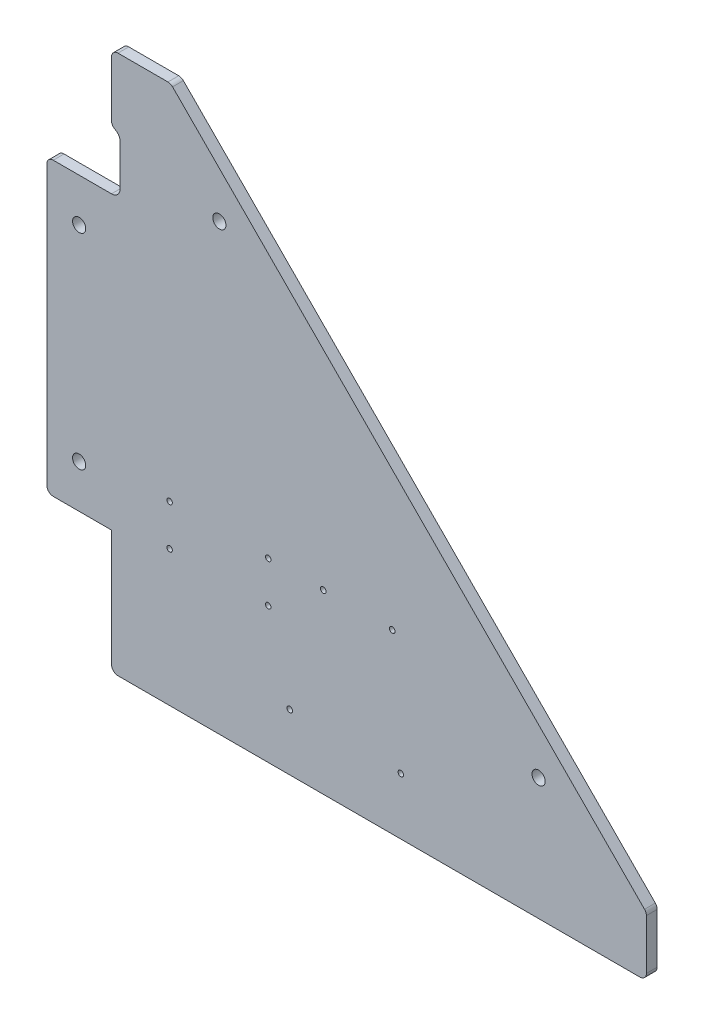
ISO-10303-21;
HEADER;
FILE_DESCRIPTION(('STEP AP214'),'2;1');
FILE_NAME('part.step','',(''),(''),'','','');
FILE_SCHEMA(('AUTOMOTIVE_DESIGN { 1 0 10303 214 1 1 1 1 }'));
ENDSEC;
DATA;
#1=APPLICATION_CONTEXT('core data for automotive mechanical design processes');
#2=APPLICATION_PROTOCOL_DEFINITION('international standard','automotive_design',2000,#1);
#3=PRODUCT_CONTEXT('',#1,'mechanical');
#4=PRODUCT('Part','Part','',(#3));
#5=PRODUCT_RELATED_PRODUCT_CATEGORY('part','',(#4));
#6=PRODUCT_DEFINITION_FORMATION('','',#4);
#7=PRODUCT_DEFINITION_CONTEXT('part definition',#1,'design');
#8=PRODUCT_DEFINITION('design','',#6,#7);
#9=PRODUCT_DEFINITION_SHAPE('','',#8);
#10=(LENGTH_UNIT() NAMED_UNIT(*) SI_UNIT(.MILLI.,.METRE.));
#11=(NAMED_UNIT(*) PLANE_ANGLE_UNIT() SI_UNIT($,.RADIAN.));
#12=(NAMED_UNIT(*) SI_UNIT($,.STERADIAN.) SOLID_ANGLE_UNIT());
#13=UNCERTAINTY_MEASURE_WITH_UNIT(LENGTH_MEASURE(1.E-05),#10,'distance_accuracy_value','');
#14=(GEOMETRIC_REPRESENTATION_CONTEXT(3) GLOBAL_UNCERTAINTY_ASSIGNED_CONTEXT((#13)) GLOBAL_UNIT_ASSIGNED_CONTEXT((#10,
#11,#12)) REPRESENTATION_CONTEXT('',''));
#15=CARTESIAN_POINT('',(0.,0.,0.));
#16=DIRECTION('',(0.,0.,1.));
#17=DIRECTION('',(1.,0.,0.));
#18=AXIS2_PLACEMENT_3D('',#15,#16,#17);
#19=CARTESIAN_POINT('',(30.,139.,5.));
#20=DIRECTION('',(0.,0.,-1.));
#21=DIRECTION('',(-1.,0.,0.));
#22=AXIS2_PLACEMENT_3D('',#19,#20,#21);
#23=CYLINDRICAL_SURFACE('',#22,4.);
#24=CARTESIAN_POINT('',(30.,139.,0.));
#25=DIRECTION('',(0.,0.,1.));
#26=DIRECTION('',(1.,0.,0.));
#27=AXIS2_PLACEMENT_3D('',#24,#25,#26);
#28=CIRCLE('',#27,4.);
#29=CARTESIAN_POINT('',(30.,135.,0.));
#30=VERTEX_POINT('',#29);
#31=CARTESIAN_POINT('',(34.,139.,0.));
#32=VERTEX_POINT('',#31);
#33=EDGE_CURVE('E188',#30,#32,#28,.T.);
#34=ORIENTED_EDGE('',*,*,#33,.F.);
#35=DIRECTION('',(0.,0.,-1.));
#36=VECTOR('',#35,1.);
#37=CARTESIAN_POINT('',(30.,135.,5.));
#38=LINE('',#37,#36);
#39=CARTESIAN_POINT('',(30.,135.,5.));
#40=VERTEX_POINT('',#39);
#41=EDGE_CURVE('E177',#40,#30,#38,.T.);
#42=ORIENTED_EDGE('',*,*,#41,.F.);
#43=CARTESIAN_POINT('',(30.,139.,5.));
#44=DIRECTION('',(0.,0.,1.));
#45=DIRECTION('',(1.,0.,0.));
#46=AXIS2_PLACEMENT_3D('',#43,#44,#45);
#47=CIRCLE('',#46,4.);
#48=CARTESIAN_POINT('',(34.,139.,5.));
#49=VERTEX_POINT('',#48);
#50=EDGE_CURVE('E183',#40,#49,#47,.T.);
#51=ORIENTED_EDGE('',*,*,#50,.T.);
#52=DIRECTION('',(0.,0.,-1.));
#53=VECTOR('',#52,1.);
#54=CARTESIAN_POINT('',(34.,139.,5.));
#55=LINE('',#54,#53);
#56=EDGE_CURVE('E226',#49,#32,#55,.T.);
#57=ORIENTED_EDGE('',*,*,#56,.T.);
#58=EDGE_LOOP('',(#34,#42,#51,#57));
#59=FACE_BOUND('',#58,.T.);
#60=ADVANCED_FACE('F35',(#59),#23,.F.);
#61=CARTESIAN_POINT('',(0.,135.,5.));
#62=DIRECTION('',(0.,1.,0.));
#63=DIRECTION('',(0.,0.,1.));
#64=AXIS2_PLACEMENT_3D('',#61,#62,#63);
#65=PLANE('',#64);
#66=DIRECTION('',(1.,0.,0.));
#67=VECTOR('',#66,1.);
#68=CARTESIAN_POINT('',(0.,135.,0.));
#69=LINE('',#68,#67);
#70=CARTESIAN_POINT('',(3.,135.,0.));
#71=VERTEX_POINT('',#70);
#72=EDGE_CURVE('E253',#71,#30,#69,.T.);
#73=ORIENTED_EDGE('',*,*,#72,.F.);
#74=DIRECTION('',(0.,0.,-1.));
#75=VECTOR('',#74,1.);
#76=CARTESIAN_POINT('',(3.,135.,5.));
#77=LINE('',#76,#75);
#78=CARTESIAN_POINT('',(3.,135.,5.));
#79=VERTEX_POINT('',#78);
#80=EDGE_CURVE('E11',#71,#79,#77,.F.);
#81=ORIENTED_EDGE('',*,*,#80,.T.);
#82=DIRECTION('',(1.,0.,0.));
#83=VECTOR('',#82,1.);
#84=CARTESIAN_POINT('',(0.,135.,5.));
#85=LINE('',#84,#83);
#86=EDGE_CURVE('E173',#79,#40,#85,.T.);
#87=ORIENTED_EDGE('',*,*,#86,.T.);
#88=ORIENTED_EDGE('',*,*,#41,.T.);
#89=EDGE_LOOP('',(#73,#81,#87,#88));
#90=FACE_BOUND('',#89,.T.);
#91=ADVANCED_FACE('F176',(#90),#65,.T.);
#92=CARTESIAN_POINT('',(0.,0.,5.));
#93=DIRECTION('',(-1.,0.,0.));
#94=DIRECTION('',(0.,0.,1.));
#95=AXIS2_PLACEMENT_3D('',#92,#93,#94);
#96=PLANE('',#95);
#97=DIRECTION('',(0.,1.,0.));
#98=VECTOR('',#97,1.);
#99=CARTESIAN_POINT('',(0.,0.,0.));
#100=LINE('',#99,#98);
#101=CARTESIAN_POINT('',(0.,3.,0.));
#102=VERTEX_POINT('',#101);
#103=CARTESIAN_POINT('',(0.,132.,0.));
#104=VERTEX_POINT('',#103);
#105=EDGE_CURVE('E255',#102,#104,#100,.T.);
#106=ORIENTED_EDGE('',*,*,#105,.F.);
#107=DIRECTION('',(0.,0.,-1.));
#108=VECTOR('',#107,1.);
#109=CARTESIAN_POINT('',(0.,3.,5.));
#110=LINE('',#109,#108);
#111=CARTESIAN_POINT('',(0.,3.,5.));
#112=VERTEX_POINT('',#111);
#113=EDGE_CURVE('E43',#102,#112,#110,.F.);
#114=ORIENTED_EDGE('',*,*,#113,.T.);
#115=DIRECTION('',(0.,1.,0.));
#116=VECTOR('',#115,1.);
#117=CARTESIAN_POINT('',(0.,0.,5.));
#118=LINE('',#117,#116);
#119=CARTESIAN_POINT('',(0.,132.,5.));
#120=VERTEX_POINT('',#119);
#121=EDGE_CURVE('E182',#112,#120,#118,.T.);
#122=ORIENTED_EDGE('',*,*,#121,.T.);
#123=DIRECTION('',(0.,0.,-1.));
#124=VECTOR('',#123,1.);
#125=CARTESIAN_POINT('',(0.,132.,5.));
#126=LINE('',#125,#124);
#127=EDGE_CURVE('E351',#120,#104,#126,.T.);
#128=ORIENTED_EDGE('',*,*,#127,.T.);
#129=EDGE_LOOP('',(#106,#114,#122,#128));
#130=FACE_BOUND('',#129,.T.);
#131=ADVANCED_FACE('F357',(#130),#96,.T.);
#132=CARTESIAN_POINT('',(0.,0.,5.));
#133=DIRECTION('',(0.,-1.,0.));
#134=DIRECTION('',(1.,0.,0.));
#135=AXIS2_PLACEMENT_3D('',#132,#133,#134);
#136=PLANE('',#135);
#137=DIRECTION('',(-1.,0.,0.));
#138=VECTOR('',#137,1.);
#139=CARTESIAN_POINT('',(0.,0.,5.));
#140=LINE('',#139,#138);
#141=CARTESIAN_POINT('',(30.,0.,5.));
#142=VERTEX_POINT('',#141);
#143=CARTESIAN_POINT('',(3.,0.,5.));
#144=VERTEX_POINT('',#143);
#145=EDGE_CURVE('E206',#142,#144,#140,.T.);
#146=ORIENTED_EDGE('',*,*,#145,.T.);
#147=DIRECTION('',(0.,0.,-1.));
#148=VECTOR('',#147,1.);
#149=CARTESIAN_POINT('',(3.,0.,5.));
#150=LINE('',#149,#148);
#151=CARTESIAN_POINT('',(3.,0.,0.));
#152=VERTEX_POINT('',#151);
#153=EDGE_CURVE('E348',#144,#152,#150,.T.);
#154=ORIENTED_EDGE('',*,*,#153,.T.);
#155=DIRECTION('',(-1.,0.,0.));
#156=VECTOR('',#155,1.);
#157=CARTESIAN_POINT('',(0.,0.,0.));
#158=LINE('',#157,#156);
#159=CARTESIAN_POINT('',(30.,0.,0.));
#160=VERTEX_POINT('',#159);
#161=EDGE_CURVE('E258',#160,#152,#158,.T.);
#162=ORIENTED_EDGE('',*,*,#161,.F.);
#163=DIRECTION('',(0.,0.,-1.));
#164=VECTOR('',#163,1.);
#165=CARTESIAN_POINT('',(30.,0.,5.));
#166=LINE('',#165,#164);
#167=EDGE_CURVE('E190',#142,#160,#166,.T.);
#168=ORIENTED_EDGE('',*,*,#167,.F.);
#169=EDGE_LOOP('',(#146,#154,#162,#168));
#170=FACE_BOUND('',#169,.T.);
#171=ADVANCED_FACE('F366',(#170),#136,.T.);
#172=CARTESIAN_POINT('',(30.,0.,5.));
#173=DIRECTION('',(-1.,0.,0.));
#174=DIRECTION('',(0.,-1.,0.));
#175=AXIS2_PLACEMENT_3D('',#172,#173,#174);
#176=PLANE('',#175);
#177=DIRECTION('',(0.,1.,0.));
#178=VECTOR('',#177,1.);
#179=CARTESIAN_POINT('',(30.,0.,0.));
#180=LINE('',#179,#178);
#181=CARTESIAN_POINT('',(30.,-54.,0.));
#182=VERTEX_POINT('',#181);
#183=EDGE_CURVE('E261',#182,#160,#180,.T.);
#184=ORIENTED_EDGE('',*,*,#183,.F.);
#185=DIRECTION('',(0.,0.,-1.));
#186=VECTOR('',#185,1.);
#187=CARTESIAN_POINT('',(30.,-54.,5.));
#188=LINE('',#187,#186);
#189=CARTESIAN_POINT('',(30.,-54.,5.));
#190=VERTEX_POINT('',#189);
#191=EDGE_CURVE('E346',#182,#190,#188,.F.);
#192=ORIENTED_EDGE('',*,*,#191,.T.);
#193=DIRECTION('',(0.,1.,0.));
#194=VECTOR('',#193,1.);
#195=CARTESIAN_POINT('',(30.,0.,5.));
#196=LINE('',#195,#194);
#197=EDGE_CURVE('E209',#190,#142,#196,.T.);
#198=ORIENTED_EDGE('',*,*,#197,.T.);
#199=ORIENTED_EDGE('',*,*,#167,.T.);
#200=EDGE_LOOP('',(#184,#192,#198,#199));
#201=FACE_BOUND('',#200,.T.);
#202=ADVANCED_FACE('F374',(#201),#176,.T.);
#203=CARTESIAN_POINT('',(0.,-57.,5.));
#204=DIRECTION('',(0.,-1.,0.));
#205=DIRECTION('',(1.,0.,0.));
#206=AXIS2_PLACEMENT_3D('',#203,#204,#205);
#207=PLANE('',#206);
#208=DIRECTION('',(-1.,0.,0.));
#209=VECTOR('',#208,1.);
#210=CARTESIAN_POINT('',(0.,-57.,0.));
#211=LINE('',#210,#209);
#212=CARTESIAN_POINT('',(275.,-57.,0.));
#213=VERTEX_POINT('',#212);
#214=CARTESIAN_POINT('',(33.,-57.,0.));
#215=VERTEX_POINT('',#214);
#216=EDGE_CURVE('E263',#213,#215,#211,.T.);
#217=ORIENTED_EDGE('',*,*,#216,.F.);
#218=DIRECTION('',(0.,0.,-1.));
#219=VECTOR('',#218,1.);
#220=CARTESIAN_POINT('',(275.,-57.,5.));
#221=LINE('',#220,#219);
#222=CARTESIAN_POINT('',(275.,-57.,5.));
#223=VERTEX_POINT('',#222);
#224=EDGE_CURVE('E344',#213,#223,#221,.F.);
#225=ORIENTED_EDGE('',*,*,#224,.T.);
#226=DIRECTION('',(-1.,0.,0.));
#227=VECTOR('',#226,1.);
#228=CARTESIAN_POINT('',(0.,-57.,5.));
#229=LINE('',#228,#227);
#230=CARTESIAN_POINT('',(33.,-57.,5.));
#231=VERTEX_POINT('',#230);
#232=EDGE_CURVE('E211',#223,#231,#229,.T.);
#233=ORIENTED_EDGE('',*,*,#232,.T.);
#234=DIRECTION('',(0.,0.,-1.));
#235=VECTOR('',#234,1.);
#236=CARTESIAN_POINT('',(33.,-57.,5.));
#237=LINE('',#236,#235);
#238=EDGE_CURVE('E341',#231,#215,#237,.T.);
#239=ORIENTED_EDGE('',*,*,#238,.T.);
#240=EDGE_LOOP('',(#217,#225,#233,#239));
#241=FACE_BOUND('',#240,.T.);
#242=ADVANCED_FACE('F383',(#241),#207,.T.);
#243=CARTESIAN_POINT('',(278.,0.,5.));
#244=DIRECTION('',(-1.,0.,0.));
#245=DIRECTION('',(0.,0.,1.));
#246=AXIS2_PLACEMENT_3D('',#243,#244,#245);
#247=PLANE('',#246);
#248=DIRECTION('',(0.,1.,0.));
#249=VECTOR('',#248,1.);
#250=CARTESIAN_POINT('',(278.,0.,0.));
#251=LINE('',#250,#249);
#252=CARTESIAN_POINT('',(278.,-54.,0.));
#253=VERTEX_POINT('',#252);
#254=CARTESIAN_POINT('',(278.,-30.8047167386209,0.));
#255=VERTEX_POINT('',#254);
#256=EDGE_CURVE('E266',#253,#255,#251,.T.);
#257=ORIENTED_EDGE('',*,*,#256,.T.);
#258=DIRECTION('',(0.,0.,-1.));
#259=VECTOR('',#258,1.);
#260=CARTESIAN_POINT('',(278.,-30.8047167386209,5.));
#261=LINE('',#260,#259);
#262=CARTESIAN_POINT('',(278.,-30.8047167386209,5.));
#263=VERTEX_POINT('',#262);
#264=EDGE_CURVE('E339',#255,#263,#261,.F.);
#265=ORIENTED_EDGE('',*,*,#264,.T.);
#266=DIRECTION('',(0.,1.,0.));
#267=VECTOR('',#266,1.);
#268=CARTESIAN_POINT('',(278.,0.,5.));
#269=LINE('',#268,#267);
#270=CARTESIAN_POINT('',(278.,-54.,5.));
#271=VERTEX_POINT('',#270);
#272=EDGE_CURVE('E214',#271,#263,#269,.T.);
#273=ORIENTED_EDGE('',*,*,#272,.F.);
#274=DIRECTION('',(0.,0.,-1.));
#275=VECTOR('',#274,1.);
#276=CARTESIAN_POINT('',(278.,-54.,0.));
#277=LINE('',#276,#275);
#278=EDGE_CURVE('E336',#271,#253,#277,.T.);
#279=ORIENTED_EDGE('',*,*,#278,.T.);
#280=EDGE_LOOP('',(#257,#265,#273,#279));
#281=FACE_BOUND('',#280,.T.);
#282=ADVANCED_FACE('F392',(#281),#247,.F.);
#283=CARTESIAN_POINT('',(125.470259247196,124.34279140115,5.));
#284=DIRECTION('',(-0.710290894245381,-0.703908265011924,0.));
#285=DIRECTION('',(0.703908265011924,-0.710290894245381,0.));
#286=AXIS2_PLACEMENT_3D('',#283,#284,#285);
#287=PLANE('',#286);
#288=DIRECTION('',(-0.703908265011924,0.710290894245381,0.));
#289=VECTOR('',#288,1.);
#290=CARTESIAN_POINT('',(125.470259247196,124.34279140115,0.));
#291=LINE('',#290,#289);
#292=CARTESIAN_POINT('',(277.130872682736,-28.6929919435851,0.));
#293=VERTEX_POINT('',#292);
#294=CARTESIAN_POINT('',(58.3102932199261,192.111724795036,0.));
#295=VERTEX_POINT('',#294);
#296=EDGE_CURVE('E269',#293,#295,#291,.T.);
#297=ORIENTED_EDGE('',*,*,#296,.T.);
#298=DIRECTION('',(0.,0.,-1.));
#299=VECTOR('',#298,1.);
#300=CARTESIAN_POINT('',(58.3102932199261,192.111724795036,5.));
#301=LINE('',#300,#299);
#302=CARTESIAN_POINT('',(58.3102932199261,192.111724795036,5.));
#303=VERTEX_POINT('',#302);
#304=EDGE_CURVE('E334',#295,#303,#301,.F.);
#305=ORIENTED_EDGE('',*,*,#304,.T.);
#306=DIRECTION('',(-0.703908265011924,0.710290894245381,0.));
#307=VECTOR('',#306,1.);
#308=CARTESIAN_POINT('',(125.470259247196,124.34279140115,5.));
#309=LINE('',#308,#307);
#310=CARTESIAN_POINT('',(277.130872682736,-28.6929919435851,5.));
#311=VERTEX_POINT('',#310);
#312=EDGE_CURVE('E217',#311,#303,#309,.T.);
#313=ORIENTED_EDGE('',*,*,#312,.F.);
#314=DIRECTION('',(0.,0.,-1.));
#315=VECTOR('',#314,1.);
#316=CARTESIAN_POINT('',(277.130872682736,-28.6929919435851,5.));
#317=LINE('',#316,#315);
#318=EDGE_CURVE('E331',#311,#293,#317,.T.);
#319=ORIENTED_EDGE('',*,*,#318,.T.);
#320=EDGE_LOOP('',(#297,#305,#313,#319));
#321=FACE_BOUND('',#320,.T.);
#322=ADVANCED_FACE('F401',(#321),#287,.F.);
#323=CARTESIAN_POINT('',(0.,193.,5.));
#324=DIRECTION('',(0.,-1.,0.));
#325=DIRECTION('',(0.,0.,-1.));
#326=AXIS2_PLACEMENT_3D('',#323,#324,#325);
#327=PLANE('',#326);
#328=DIRECTION('',(-1.,0.,0.));
#329=VECTOR('',#328,1.);
#330=CARTESIAN_POINT('',(0.,193.,0.));
#331=LINE('',#330,#329);
#332=CARTESIAN_POINT('',(56.17942053719,193.,0.));
#333=VERTEX_POINT('',#332);
#334=CARTESIAN_POINT('',(33.,193.,0.));
#335=VERTEX_POINT('',#334);
#336=EDGE_CURVE('E272',#333,#335,#331,.T.);
#337=ORIENTED_EDGE('',*,*,#336,.T.);
#338=DIRECTION('',(0.,0.,-1.));
#339=VECTOR('',#338,1.);
#340=CARTESIAN_POINT('',(33.,193.,5.));
#341=LINE('',#340,#339);
#342=CARTESIAN_POINT('',(33.,193.,5.));
#343=VERTEX_POINT('',#342);
#344=EDGE_CURVE('E50',#335,#343,#341,.F.);
#345=ORIENTED_EDGE('',*,*,#344,.T.);
#346=DIRECTION('',(-1.,0.,0.));
#347=VECTOR('',#346,1.);
#348=CARTESIAN_POINT('',(0.,193.,5.));
#349=LINE('',#348,#347);
#350=CARTESIAN_POINT('',(56.17942053719,193.,5.));
#351=VERTEX_POINT('',#350);
#352=EDGE_CURVE('E219',#351,#343,#349,.T.);
#353=ORIENTED_EDGE('',*,*,#352,.F.);
#354=DIRECTION('',(0.,0.,-1.));
#355=VECTOR('',#354,1.);
#356=CARTESIAN_POINT('',(56.17942053719,193.,5.));
#357=LINE('',#356,#355);
#358=EDGE_CURVE('E327',#351,#333,#357,.T.);
#359=ORIENTED_EDGE('',*,*,#358,.T.);
#360=EDGE_LOOP('',(#337,#345,#353,#359));
#361=FACE_BOUND('',#360,.T.);
#362=ADVANCED_FACE('F407',(#361),#327,.F.);
#363=CARTESIAN_POINT('',(30.,0.,5.));
#364=DIRECTION('',(1.,0.,0.));
#365=DIRECTION('',(0.,1.,0.));
#366=AXIS2_PLACEMENT_3D('',#363,#364,#365);
#367=PLANE('',#366);
#368=DIRECTION('',(0.,-1.,0.));
#369=VECTOR('',#368,1.);
#370=CARTESIAN_POINT('',(30.,0.,0.));
#371=LINE('',#370,#369);
#372=CARTESIAN_POINT('',(30.,190.,0.));
#373=VERTEX_POINT('',#372);
#374=CARTESIAN_POINT('',(30.,164.324555320337,0.));
#375=VERTEX_POINT('',#374);
#376=EDGE_CURVE('E274',#373,#375,#371,.T.);
#377=ORIENTED_EDGE('',*,*,#376,.T.);
#378=DIRECTION('',(0.,0.,-1.));
#379=VECTOR('',#378,1.);
#380=CARTESIAN_POINT('',(30.,164.324555320337,5.));
#381=LINE('',#380,#379);
#382=CARTESIAN_POINT('',(30.,164.324555320337,5.));
#383=VERTEX_POINT('',#382);
#384=EDGE_CURVE('E310',#375,#383,#381,.F.);
#385=ORIENTED_EDGE('',*,*,#384,.T.);
#386=DIRECTION('',(0.,-1.,0.));
#387=VECTOR('',#386,1.);
#388=CARTESIAN_POINT('',(30.,0.,5.));
#389=LINE('',#388,#387);
#390=CARTESIAN_POINT('',(30.,190.,5.));
#391=VERTEX_POINT('',#390);
#392=EDGE_CURVE('E221',#391,#383,#389,.T.);
#393=ORIENTED_EDGE('',*,*,#392,.F.);
#394=DIRECTION('',(0.,0.,-1.));
#395=VECTOR('',#394,1.);
#396=CARTESIAN_POINT('',(30.,190.,5.));
#397=LINE('',#396,#395);
#398=EDGE_CURVE('E307',#391,#373,#397,.T.);
#399=ORIENTED_EDGE('',*,*,#398,.T.);
#400=EDGE_LOOP('',(#377,#385,#393,#399));
#401=FACE_BOUND('',#400,.T.);
#402=ADVANCED_FACE('F415',(#401),#367,.F.);
#403=CARTESIAN_POINT('',(30.,158.,5.));
#404=DIRECTION('',(0.,0.,-1.));
#405=DIRECTION('',(-1.,0.,0.));
#406=AXIS2_PLACEMENT_3D('',#403,#404,#405);
#407=CYLINDRICAL_SURFACE('',#406,4.);
#408=CARTESIAN_POINT('',(30.,158.,5.));
#409=DIRECTION('',(0.,0.,1.));
#410=DIRECTION('',(1.,0.,0.));
#411=AXIS2_PLACEMENT_3D('',#408,#409,#410);
#412=CIRCLE('',#411,4.);
#413=CARTESIAN_POINT('',(31.7142857142857,161.614031611621,5.));
#414=VERTEX_POINT('',#413);
#415=CARTESIAN_POINT('',(34.,158.,5.));
#416=VERTEX_POINT('',#415);
#417=EDGE_CURVE('E223',#414,#416,#412,.F.);
#418=ORIENTED_EDGE('',*,*,#417,.F.);
#419=DIRECTION('',(0.,0.,-1.));
#420=VECTOR('',#419,1.);
#421=CARTESIAN_POINT('',(31.7142857142857,161.614031611621,5.));
#422=LINE('',#421,#420);
#423=CARTESIAN_POINT('',(31.7142857142857,161.614031611621,0.));
#424=VERTEX_POINT('',#423);
#425=EDGE_CURVE('E189',#414,#424,#422,.T.);
#426=ORIENTED_EDGE('',*,*,#425,.T.);
#427=CARTESIAN_POINT('',(30.,158.,0.));
#428=DIRECTION('',(0.,0.,1.));
#429=DIRECTION('',(1.,0.,0.));
#430=AXIS2_PLACEMENT_3D('',#427,#428,#429);
#431=CIRCLE('',#430,4.);
#432=CARTESIAN_POINT('',(34.,158.,0.));
#433=VERTEX_POINT('',#432);
#434=EDGE_CURVE('E277',#424,#433,#431,.F.);
#435=ORIENTED_EDGE('',*,*,#434,.T.);
#436=DIRECTION('',(0.,0.,-1.));
#437=VECTOR('',#436,1.);
#438=CARTESIAN_POINT('',(34.,158.,5.));
#439=LINE('',#438,#437);
#440=EDGE_CURVE('E284',#416,#433,#439,.T.);
#441=ORIENTED_EDGE('',*,*,#440,.F.);
#442=EDGE_LOOP('',(#418,#426,#435,#441));
#443=FACE_BOUND('',#442,.T.);
#444=ADVANCED_FACE('F424',(#443),#407,.F.);
#445=CARTESIAN_POINT('',(15.,115.,5.));
#446=DIRECTION('',(0.,0.,-1.));
#447=DIRECTION('',(-1.,0.,0.));
#448=AXIS2_PLACEMENT_3D('',#445,#446,#447);
#449=CYLINDRICAL_SURFACE('',#448,3.05);
#450=CARTESIAN_POINT('',(15.,115.,5.));
#451=DIRECTION('',(0.,0.,1.));
#452=DIRECTION('',(1.,0.,0.));
#453=AXIS2_PLACEMENT_3D('',#450,#451,#452);
#454=CIRCLE('',#453,3.05);
#455=CARTESIAN_POINT('',(18.05,115.,5.));
#456=VERTEX_POINT('',#455);
#457=EDGE_CURVE('E197',#456,#456,#454,.T.);
#458=ORIENTED_EDGE('',*,*,#457,.T.);
#459=EDGE_LOOP('',(#458));
#460=FACE_BOUND('',#459,.T.);
#461=CARTESIAN_POINT('',(15.,115.,0.));
#462=DIRECTION('',(0.,0.,1.));
#463=DIRECTION('',(1.,0.,0.));
#464=AXIS2_PLACEMENT_3D('',#461,#462,#463);
#465=CIRCLE('',#464,3.05);
#466=CARTESIAN_POINT('',(18.05,115.,0.));
#467=VERTEX_POINT('',#466);
#468=EDGE_CURVE('E249',#467,#467,#465,.T.);
#469=ORIENTED_EDGE('',*,*,#468,.F.);
#470=EDGE_LOOP('',(#469));
#471=FACE_BOUND('',#470,.T.);
#472=ADVANCED_FACE('F446',(#460,#471),#449,.F.);
#473=CARTESIAN_POINT('',(15.,20.,5.));
#474=DIRECTION('',(0.,0.,-1.));
#475=DIRECTION('',(-1.,0.,0.));
#476=AXIS2_PLACEMENT_3D('',#473,#474,#475);
#477=CYLINDRICAL_SURFACE('',#476,3.05);
#478=CARTESIAN_POINT('',(15.,20.,5.));
#479=DIRECTION('',(0.,0.,1.));
#480=DIRECTION('',(1.,0.,0.));
#481=AXIS2_PLACEMENT_3D('',#478,#479,#480);
#482=CIRCLE('',#481,3.05);
#483=CARTESIAN_POINT('',(18.05,20.,5.));
#484=VERTEX_POINT('',#483);
#485=EDGE_CURVE('E200',#484,#484,#482,.T.);
#486=ORIENTED_EDGE('',*,*,#485,.T.);
#487=EDGE_LOOP('',(#486));
#488=FACE_BOUND('',#487,.T.);
#489=CARTESIAN_POINT('',(15.,20.,0.));
#490=DIRECTION('',(0.,0.,1.));
#491=DIRECTION('',(1.,0.,0.));
#492=AXIS2_PLACEMENT_3D('',#489,#490,#491);
#493=CIRCLE('',#492,3.05);
#494=CARTESIAN_POINT('',(18.05,20.,0.));
#495=VERTEX_POINT('',#494);
#496=EDGE_CURVE('E246',#495,#495,#493,.T.);
#497=ORIENTED_EDGE('',*,*,#496,.F.);
#498=EDGE_LOOP('',(#497));
#499=FACE_BOUND('',#498,.T.);
#500=ADVANCED_FACE('F449',(#488,#499),#477,.F.);
#501=CARTESIAN_POINT('',(80.,148.915753478768,5.));
#502=DIRECTION('',(0.,0.,-1.));
#503=DIRECTION('',(-1.,0.,0.));
#504=AXIS2_PLACEMENT_3D('',#501,#502,#503);
#505=CYLINDRICAL_SURFACE('',#504,3.04999999999999);
#506=CARTESIAN_POINT('',(80.,148.915753478768,5.));
#507=DIRECTION('',(0.,0.,1.));
#508=DIRECTION('',(1.,0.,0.));
#509=AXIS2_PLACEMENT_3D('',#506,#507,#508);
#510=CIRCLE('',#509,3.04999999999999);
#511=CARTESIAN_POINT('',(83.05,148.915753478768,5.));
#512=VERTEX_POINT('',#511);
#513=EDGE_CURVE('E766',#512,#512,#510,.T.);
#514=ORIENTED_EDGE('',*,*,#513,.T.);
#515=EDGE_LOOP('',(#514));
#516=FACE_BOUND('',#515,.T.);
#517=CARTESIAN_POINT('',(80.,148.915753478768,0.));
#518=DIRECTION('',(0.,0.,1.));
#519=DIRECTION('',(1.,0.,0.));
#520=AXIS2_PLACEMENT_3D('',#517,#518,#519);
#521=CIRCLE('',#520,3.04999999999999);
#522=CARTESIAN_POINT('',(83.05,148.915753478768,0.));
#523=VERTEX_POINT('',#522);
#524=EDGE_CURVE('E243',#523,#523,#521,.T.);
#525=ORIENTED_EDGE('',*,*,#524,.F.);
#526=EDGE_LOOP('',(#525));
#527=FACE_BOUND('',#526,.T.);
#528=ADVANCED_FACE('F453',(#516,#527),#505,.F.);
#529=CARTESIAN_POINT('',(228.,-0.426224124713721,5.));
#530=DIRECTION('',(0.,0.,-1.));
#531=DIRECTION('',(-1.,0.,0.));
#532=AXIS2_PLACEMENT_3D('',#529,#530,#531);
#533=CYLINDRICAL_SURFACE('',#532,3.05000000000002);
#534=CARTESIAN_POINT('',(228.,-0.426224124713721,5.));
#535=DIRECTION('',(0.,0.,1.));
#536=DIRECTION('',(1.,0.,0.));
#537=AXIS2_PLACEMENT_3D('',#534,#535,#536);
#538=CIRCLE('',#537,3.05000000000002);
#539=CARTESIAN_POINT('',(231.05,-0.426224124713721,5.));
#540=VERTEX_POINT('',#539);
#541=EDGE_CURVE('E763',#540,#540,#538,.T.);
#542=ORIENTED_EDGE('',*,*,#541,.T.);
#543=EDGE_LOOP('',(#542));
#544=FACE_BOUND('',#543,.T.);
#545=CARTESIAN_POINT('',(228.,-0.426224124713721,0.));
#546=DIRECTION('',(0.,0.,1.));
#547=DIRECTION('',(1.,0.,0.));
#548=AXIS2_PLACEMENT_3D('',#545,#546,#547);
#549=CIRCLE('',#548,3.05000000000002);
#550=CARTESIAN_POINT('',(231.05,-0.426224124713721,0.));
#551=VERTEX_POINT('',#550);
#552=EDGE_CURVE('E240',#551,#551,#549,.T.);
#553=ORIENTED_EDGE('',*,*,#552,.F.);
#554=EDGE_LOOP('',(#553));
#555=FACE_BOUND('',#554,.T.);
#556=ADVANCED_FACE('F457',(#544,#555),#533,.F.);
#557=CARTESIAN_POINT('',(56.9355070787499,25.,5.));
#558=DIRECTION('',(0.,0.,-1.));
#559=DIRECTION('',(-1.,0.,0.));
#560=AXIS2_PLACEMENT_3D('',#557,#558,#559);
#561=CYLINDRICAL_SURFACE('',#560,1.27);
#562=CARTESIAN_POINT('',(56.9355070787499,25.,5.));
#563=DIRECTION('',(0.,0.,1.));
#564=DIRECTION('',(1.,0.,0.));
#565=AXIS2_PLACEMENT_3D('',#562,#563,#564);
#566=CIRCLE('',#565,1.27);
#567=CARTESIAN_POINT('',(58.2055070787499,25.,5.));
#568=VERTEX_POINT('',#567);
#569=EDGE_CURVE('E760',#568,#568,#566,.T.);
#570=ORIENTED_EDGE('',*,*,#569,.T.);
#571=EDGE_LOOP('',(#570));
#572=FACE_BOUND('',#571,.T.);
#573=CARTESIAN_POINT('',(56.9355070787499,25.,0.));
#574=DIRECTION('',(0.,0.,1.));
#575=DIRECTION('',(1.,0.,0.));
#576=AXIS2_PLACEMENT_3D('',#573,#574,#575);
#577=CIRCLE('',#576,1.27);
#578=CARTESIAN_POINT('',(58.2055070787499,25.,0.));
#579=VERTEX_POINT('',#578);
#580=EDGE_CURVE('E237',#579,#579,#577,.T.);
#581=ORIENTED_EDGE('',*,*,#580,.F.);
#582=EDGE_LOOP('',(#581));
#583=FACE_BOUND('',#582,.T.);
#584=ADVANCED_FACE('F461',(#572,#583),#561,.F.);
#585=CARTESIAN_POINT('',(102.65550707875,25.,5.));
#586=DIRECTION('',(0.,0.,-1.));
#587=DIRECTION('',(-1.,0.,0.));
#588=AXIS2_PLACEMENT_3D('',#585,#586,#587);
#589=CYLINDRICAL_SURFACE('',#588,1.27);
#590=CARTESIAN_POINT('',(102.65550707875,25.,5.));
#591=DIRECTION('',(0.,0.,1.));
#592=DIRECTION('',(1.,0.,0.));
#593=AXIS2_PLACEMENT_3D('',#590,#591,#592);
#594=CIRCLE('',#593,1.27);
#595=CARTESIAN_POINT('',(103.92550707875,25.,5.));
#596=VERTEX_POINT('',#595);
#597=EDGE_CURVE('E757',#596,#596,#594,.T.);
#598=ORIENTED_EDGE('',*,*,#597,.T.);
#599=EDGE_LOOP('',(#598));
#600=FACE_BOUND('',#599,.T.);
#601=CARTESIAN_POINT('',(102.65550707875,25.,0.));
#602=DIRECTION('',(0.,0.,1.));
#603=DIRECTION('',(1.,0.,0.));
#604=AXIS2_PLACEMENT_3D('',#601,#602,#603);
#605=CIRCLE('',#604,1.27);
#606=CARTESIAN_POINT('',(103.92550707875,25.,0.));
#607=VERTEX_POINT('',#606);
#608=EDGE_CURVE('E234',#607,#607,#605,.T.);
#609=ORIENTED_EDGE('',*,*,#608,.F.);
#610=EDGE_LOOP('',(#609));
#611=FACE_BOUND('',#610,.T.);
#612=ADVANCED_FACE('F465',(#600,#611),#589,.F.);
#613=CARTESIAN_POINT('',(102.65550707875,5.95000000000004,5.));
#614=DIRECTION('',(0.,0.,-1.));
#615=DIRECTION('',(-1.,0.,0.));
#616=AXIS2_PLACEMENT_3D('',#613,#614,#615);
#617=CYLINDRICAL_SURFACE('',#616,1.26999999999999);
#618=CARTESIAN_POINT('',(102.65550707875,5.95000000000004,5.));
#619=DIRECTION('',(0.,0.,1.));
#620=DIRECTION('',(1.,0.,0.));
#621=AXIS2_PLACEMENT_3D('',#618,#619,#620);
#622=CIRCLE('',#621,1.26999999999999);
#623=CARTESIAN_POINT('',(103.92550707875,5.95000000000004,5.));
#624=VERTEX_POINT('',#623);
#625=EDGE_CURVE('E754',#624,#624,#622,.T.);
#626=ORIENTED_EDGE('',*,*,#625,.T.);
#627=EDGE_LOOP('',(#626));
#628=FACE_BOUND('',#627,.T.);
#629=CARTESIAN_POINT('',(102.65550707875,5.95000000000004,0.));
#630=DIRECTION('',(0.,0.,1.));
#631=DIRECTION('',(1.,0.,0.));
#632=AXIS2_PLACEMENT_3D('',#629,#630,#631);
#633=CIRCLE('',#632,1.26999999999999);
#634=CARTESIAN_POINT('',(103.92550707875,5.95000000000004,0.));
#635=VERTEX_POINT('',#634);
#636=EDGE_CURVE('E230',#635,#635,#633,.T.);
#637=ORIENTED_EDGE('',*,*,#636,.F.);
#638=EDGE_LOOP('',(#637));
#639=FACE_BOUND('',#638,.T.);
#640=ADVANCED_FACE('F469',(#628,#639),#617,.F.);
#641=CARTESIAN_POINT('',(56.9355070787501,5.95000000000004,5.));
#642=DIRECTION('',(0.,0.,-1.));
#643=DIRECTION('',(-1.,0.,0.));
#644=AXIS2_PLACEMENT_3D('',#641,#642,#643);
#645=CYLINDRICAL_SURFACE('',#644,1.27);
#646=CARTESIAN_POINT('',(56.9355070787501,5.95000000000004,5.));
#647=DIRECTION('',(0.,0.,1.));
#648=DIRECTION('',(1.,0.,0.));
#649=AXIS2_PLACEMENT_3D('',#646,#647,#648);
#650=CIRCLE('',#649,1.27);
#651=CARTESIAN_POINT('',(58.2055070787501,5.95000000000004,5.));
#652=VERTEX_POINT('',#651);
#653=EDGE_CURVE('E282',#652,#652,#650,.T.);
#654=ORIENTED_EDGE('',*,*,#653,.T.);
#655=EDGE_LOOP('',(#654));
#656=FACE_BOUND('',#655,.T.);
#657=CARTESIAN_POINT('',(56.9355070787501,5.95000000000004,0.));
#658=DIRECTION('',(0.,0.,1.));
#659=DIRECTION('',(1.,0.,0.));
#660=AXIS2_PLACEMENT_3D('',#657,#658,#659);
#661=CIRCLE('',#660,1.27);
#662=CARTESIAN_POINT('',(58.2055070787501,5.95000000000004,0.));
#663=VERTEX_POINT('',#662);
#664=EDGE_CURVE('E227',#663,#663,#661,.T.);
#665=ORIENTED_EDGE('',*,*,#664,.F.);
#666=EDGE_LOOP('',(#665));
#667=FACE_BOUND('',#666,.T.);
#668=ADVANCED_FACE('F473',(#656,#667),#645,.F.);
#669=CARTESIAN_POINT('',(34.,0.,5.));
#670=DIRECTION('',(1.,0.,0.));
#671=DIRECTION('',(0.,1.,0.));
#672=AXIS2_PLACEMENT_3D('',#669,#670,#671);
#673=PLANE('',#672);
#674=DIRECTION('',(0.,-1.,0.));
#675=VECTOR('',#674,1.);
#676=CARTESIAN_POINT('',(34.,0.,0.));
#677=LINE('',#676,#675);
#678=EDGE_CURVE('E279',#433,#32,#677,.T.);
#679=ORIENTED_EDGE('',*,*,#678,.T.);
#680=ORIENTED_EDGE('',*,*,#56,.F.);
#681=DIRECTION('',(0.,-1.,0.));
#682=VECTOR('',#681,1.);
#683=CARTESIAN_POINT('',(34.,0.,5.));
#684=LINE('',#683,#682);
#685=EDGE_CURVE('E195',#416,#49,#684,.T.);
#686=ORIENTED_EDGE('',*,*,#685,.F.);
#687=ORIENTED_EDGE('',*,*,#440,.T.);
#688=EDGE_LOOP('',(#679,#680,#686,#687));
#689=FACE_BOUND('',#688,.T.);
#690=ADVANCED_FACE('F427',(#689),#673,.F.);
#691=CARTESIAN_POINT('',(0.,0.,5.));
#692=DIRECTION('',(0.,0.,1.));
#693=DIRECTION('',(1.,0.,0.));
#694=AXIS2_PLACEMENT_3D('',#691,#692,#693);
#695=PLANE('',#694);
#696=CARTESIAN_POINT('',(112.65550707875,-30.7,5.));
#697=DIRECTION('',(0.,0.,1.));
#698=DIRECTION('',(1.,0.,0.));
#699=AXIS2_PLACEMENT_3D('',#696,#697,#698);
#700=CIRCLE('',#699,1.29999999999999);
#701=CARTESIAN_POINT('',(113.95550707875,-30.7,5.));
#702=VERTEX_POINT('',#701);
#703=EDGE_CURVE('E730',#702,#702,#700,.T.);
#704=ORIENTED_EDGE('',*,*,#703,.F.);
#705=EDGE_LOOP('',(#704));
#706=FACE_BOUND('',#705,.T.);
#707=CARTESIAN_POINT('',(160.15550707875,25.,5.));
#708=DIRECTION('',(0.,0.,1.));
#709=DIRECTION('',(1.,0.,0.));
#710=AXIS2_PLACEMENT_3D('',#707,#708,#709);
#711=CIRCLE('',#710,1.30000000000001);
#712=CARTESIAN_POINT('',(161.45550707875,25.,5.));
#713=VERTEX_POINT('',#712);
#714=EDGE_CURVE('E742',#713,#713,#711,.T.);
#715=ORIENTED_EDGE('',*,*,#714,.F.);
#716=EDGE_LOOP('',(#715));
#717=FACE_BOUND('',#716,.T.);
#718=CARTESIAN_POINT('',(128.15550707875,25.,5.));
#719=DIRECTION('',(0.,0.,1.));
#720=DIRECTION('',(1.,0.,0.));
#721=AXIS2_PLACEMENT_3D('',#718,#719,#720);
#722=CIRCLE('',#721,1.30000000000001);
#723=CARTESIAN_POINT('',(129.45550707875,25.,5.));
#724=VERTEX_POINT('',#723);
#725=EDGE_CURVE('E741',#724,#724,#722,.T.);
#726=ORIENTED_EDGE('',*,*,#725,.F.);
#727=EDGE_LOOP('',(#726));
#728=FACE_BOUND('',#727,.T.);
#729=CARTESIAN_POINT('',(164.15550707875,-30.7,5.));
#730=DIRECTION('',(0.,0.,1.));
#731=DIRECTION('',(1.,0.,0.));
#732=AXIS2_PLACEMENT_3D('',#729,#730,#731);
#733=CIRCLE('',#732,1.30000000000001);
#734=CARTESIAN_POINT('',(165.45550707875,-30.7,5.));
#735=VERTEX_POINT('',#734);
#736=EDGE_CURVE('E735',#735,#735,#733,.T.);
#737=ORIENTED_EDGE('',*,*,#736,.F.);
#738=EDGE_LOOP('',(#737));
#739=FACE_BOUND('',#738,.T.);
#740=ORIENTED_EDGE('',*,*,#653,.F.);
#741=EDGE_LOOP('',(#740));
#742=FACE_BOUND('',#741,.T.);
#743=ORIENTED_EDGE('',*,*,#625,.F.);
#744=EDGE_LOOP('',(#743));
#745=FACE_BOUND('',#744,.T.);
#746=ORIENTED_EDGE('',*,*,#597,.F.);
#747=EDGE_LOOP('',(#746));
#748=FACE_BOUND('',#747,.T.);
#749=ORIENTED_EDGE('',*,*,#569,.F.);
#750=EDGE_LOOP('',(#749));
#751=FACE_BOUND('',#750,.T.);
#752=ORIENTED_EDGE('',*,*,#541,.F.);
#753=EDGE_LOOP('',(#752));
#754=FACE_BOUND('',#753,.T.);
#755=ORIENTED_EDGE('',*,*,#513,.F.);
#756=EDGE_LOOP('',(#755));
#757=FACE_BOUND('',#756,.T.);
#758=ORIENTED_EDGE('',*,*,#485,.F.);
#759=EDGE_LOOP('',(#758));
#760=FACE_BOUND('',#759,.T.);
#761=ORIENTED_EDGE('',*,*,#457,.F.);
#762=EDGE_LOOP('',(#761));
#763=FACE_BOUND('',#762,.T.);
#764=ORIENTED_EDGE('',*,*,#392,.T.);
#765=CARTESIAN_POINT('',(33.,164.324555320337,5.));
#766=DIRECTION('',(0.,0.,1.));
#767=DIRECTION('',(1.,0.,0.));
#768=AXIS2_PLACEMENT_3D('',#765,#766,#767);
#769=CIRCLE('',#768,3.);
#770=EDGE_CURVE('E325',#383,#414,#769,.T.);
#771=ORIENTED_EDGE('',*,*,#770,.T.);
#772=ORIENTED_EDGE('',*,*,#417,.T.);
#773=ORIENTED_EDGE('',*,*,#685,.T.);
#774=ORIENTED_EDGE('',*,*,#50,.F.);
#775=ORIENTED_EDGE('',*,*,#86,.F.);
#776=CARTESIAN_POINT('',(3.,132.,5.));
#777=DIRECTION('',(0.,0.,1.));
#778=DIRECTION('',(1.,0.,0.));
#779=AXIS2_PLACEMENT_3D('',#776,#777,#778);
#780=CIRCLE('',#779,3.);
#781=EDGE_CURVE('E312',#79,#120,#780,.T.);
#782=ORIENTED_EDGE('',*,*,#781,.T.);
#783=ORIENTED_EDGE('',*,*,#121,.F.);
#784=CARTESIAN_POINT('',(3.,3.,5.));
#785=DIRECTION('',(0.,0.,1.));
#786=DIRECTION('',(1.,0.,0.));
#787=AXIS2_PLACEMENT_3D('',#784,#785,#786);
#788=CIRCLE('',#787,3.);
#789=EDGE_CURVE('E314',#112,#144,#788,.T.);
#790=ORIENTED_EDGE('',*,*,#789,.T.);
#791=ORIENTED_EDGE('',*,*,#145,.F.);
#792=ORIENTED_EDGE('',*,*,#197,.F.);
#793=CARTESIAN_POINT('',(33.,-54.,5.));
#794=DIRECTION('',(0.,0.,1.));
#795=DIRECTION('',(1.,0.,0.));
#796=AXIS2_PLACEMENT_3D('',#793,#794,#795);
#797=CIRCLE('',#796,3.);
#798=EDGE_CURVE('E316',#190,#231,#797,.T.);
#799=ORIENTED_EDGE('',*,*,#798,.T.);
#800=ORIENTED_EDGE('',*,*,#232,.F.);
#801=CARTESIAN_POINT('',(275.,-54.,5.));
#802=DIRECTION('',(0.,0.,1.));
#803=DIRECTION('',(1.,0.,0.));
#804=AXIS2_PLACEMENT_3D('',#801,#802,#803);
#805=CIRCLE('',#804,3.);
#806=EDGE_CURVE('E318',#223,#271,#805,.T.);
#807=ORIENTED_EDGE('',*,*,#806,.T.);
#808=ORIENTED_EDGE('',*,*,#272,.T.);
#809=CARTESIAN_POINT('',(275.,-30.8047167386209,5.));
#810=DIRECTION('',(0.,0.,1.));
#811=DIRECTION('',(1.,0.,0.));
#812=AXIS2_PLACEMENT_3D('',#809,#810,#811);
#813=CIRCLE('',#812,3.);
#814=EDGE_CURVE('E320',#263,#311,#813,.T.);
#815=ORIENTED_EDGE('',*,*,#814,.T.);
#816=ORIENTED_EDGE('',*,*,#312,.T.);
#817=CARTESIAN_POINT('',(56.17942053719,190.,5.));
#818=DIRECTION('',(0.,0.,1.));
#819=DIRECTION('',(1.,0.,0.));
#820=AXIS2_PLACEMENT_3D('',#817,#818,#819);
#821=CIRCLE('',#820,3.);
#822=EDGE_CURVE('E57',#303,#351,#821,.T.);
#823=ORIENTED_EDGE('',*,*,#822,.T.);
#824=ORIENTED_EDGE('',*,*,#352,.T.);
#825=CARTESIAN_POINT('',(33.,190.,5.));
#826=DIRECTION('',(0.,0.,1.));
#827=DIRECTION('',(1.,0.,0.));
#828=AXIS2_PLACEMENT_3D('',#825,#826,#827);
#829=CIRCLE('',#828,3.);
#830=EDGE_CURVE('E323',#343,#391,#829,.T.);
#831=ORIENTED_EDGE('',*,*,#830,.T.);
#832=EDGE_LOOP('',(#764,#771,#772,#773,#774,#775,#782,#783,#790,#791,#792,#799,#800,#807,#808,
#815,#816,#823,#824,#831));
#833=FACE_BOUND('',#832,.T.);
#834=ADVANCED_FACE('F193',(#706,#717,#728,#739,#742,#745,#748,#751,#754,#757,#760,#763,#833),
#695,.T.);
#835=CARTESIAN_POINT('',(0.,0.,0.));
#836=DIRECTION('',(0.,0.,1.));
#837=DIRECTION('',(1.,0.,0.));
#838=AXIS2_PLACEMENT_3D('',#835,#836,#837);
#839=PLANE('',#838);
#840=CARTESIAN_POINT('',(112.65550707875,-30.7,0.));
#841=DIRECTION('',(0.,0.,1.));
#842=DIRECTION('',(1.,0.,0.));
#843=AXIS2_PLACEMENT_3D('',#840,#841,#842);
#844=CIRCLE('',#843,1.29999999999999);
#845=CARTESIAN_POINT('',(113.95550707875,-30.7,0.));
#846=VERTEX_POINT('',#845);
#847=EDGE_CURVE('E231',#846,#846,#844,.T.);
#848=ORIENTED_EDGE('',*,*,#847,.T.);
#849=EDGE_LOOP('',(#848));
#850=FACE_BOUND('',#849,.T.);
#851=CARTESIAN_POINT('',(160.15550707875,25.,0.));
#852=DIRECTION('',(0.,0.,1.));
#853=DIRECTION('',(1.,0.,0.));
#854=AXIS2_PLACEMENT_3D('',#851,#852,#853);
#855=CIRCLE('',#854,1.30000000000001);
#856=CARTESIAN_POINT('',(161.45550707875,25.,0.));
#857=VERTEX_POINT('',#856);
#858=EDGE_CURVE('E738',#857,#857,#855,.T.);
#859=ORIENTED_EDGE('',*,*,#858,.T.);
#860=EDGE_LOOP('',(#859));
#861=FACE_BOUND('',#860,.T.);
#862=CARTESIAN_POINT('',(128.15550707875,25.,0.));
#863=DIRECTION('',(0.,0.,1.));
#864=DIRECTION('',(1.,0.,0.));
#865=AXIS2_PLACEMENT_3D('',#862,#863,#864);
#866=CIRCLE('',#865,1.30000000000001);
#867=CARTESIAN_POINT('',(129.45550707875,25.,0.));
#868=VERTEX_POINT('',#867);
#869=EDGE_CURVE('E747',#868,#868,#866,.T.);
#870=ORIENTED_EDGE('',*,*,#869,.T.);
#871=EDGE_LOOP('',(#870));
#872=FACE_BOUND('',#871,.T.);
#873=CARTESIAN_POINT('',(164.15550707875,-30.7,0.));
#874=DIRECTION('',(0.,0.,1.));
#875=DIRECTION('',(1.,0.,0.));
#876=AXIS2_PLACEMENT_3D('',#873,#874,#875);
#877=CIRCLE('',#876,1.30000000000001);
#878=CARTESIAN_POINT('',(165.45550707875,-30.7,0.));
#879=VERTEX_POINT('',#878);
#880=EDGE_CURVE('E731',#879,#879,#877,.T.);
#881=ORIENTED_EDGE('',*,*,#880,.T.);
#882=EDGE_LOOP('',(#881));
#883=FACE_BOUND('',#882,.T.);
#884=ORIENTED_EDGE('',*,*,#664,.T.);
#885=EDGE_LOOP('',(#884));
#886=FACE_BOUND('',#885,.T.);
#887=ORIENTED_EDGE('',*,*,#636,.T.);
#888=EDGE_LOOP('',(#887));
#889=FACE_BOUND('',#888,.T.);
#890=ORIENTED_EDGE('',*,*,#608,.T.);
#891=EDGE_LOOP('',(#890));
#892=FACE_BOUND('',#891,.T.);
#893=ORIENTED_EDGE('',*,*,#580,.T.);
#894=EDGE_LOOP('',(#893));
#895=FACE_BOUND('',#894,.T.);
#896=ORIENTED_EDGE('',*,*,#552,.T.);
#897=EDGE_LOOP('',(#896));
#898=FACE_BOUND('',#897,.T.);
#899=ORIENTED_EDGE('',*,*,#524,.T.);
#900=EDGE_LOOP('',(#899));
#901=FACE_BOUND('',#900,.T.);
#902=ORIENTED_EDGE('',*,*,#496,.T.);
#903=EDGE_LOOP('',(#902));
#904=FACE_BOUND('',#903,.T.);
#905=ORIENTED_EDGE('',*,*,#468,.T.);
#906=EDGE_LOOP('',(#905));
#907=FACE_BOUND('',#906,.T.);
#908=ORIENTED_EDGE('',*,*,#434,.F.);
#909=CARTESIAN_POINT('',(33.,164.324555320337,0.));
#910=DIRECTION('',(0.,0.,1.));
#911=DIRECTION('',(1.,0.,0.));
#912=AXIS2_PLACEMENT_3D('',#909,#910,#911);
#913=CIRCLE('',#912,3.);
#914=EDGE_CURVE('E305',#424,#375,#913,.F.);
#915=ORIENTED_EDGE('',*,*,#914,.T.);
#916=ORIENTED_EDGE('',*,*,#376,.F.);
#917=CARTESIAN_POINT('',(33.,190.,0.));
#918=DIRECTION('',(0.,0.,1.));
#919=DIRECTION('',(1.,0.,0.));
#920=AXIS2_PLACEMENT_3D('',#917,#918,#919);
#921=CIRCLE('',#920,3.);
#922=EDGE_CURVE('E303',#373,#335,#921,.F.);
#923=ORIENTED_EDGE('',*,*,#922,.T.);
#924=ORIENTED_EDGE('',*,*,#336,.F.);
#925=CARTESIAN_POINT('',(56.17942053719,190.,0.));
#926=DIRECTION('',(0.,0.,1.));
#927=DIRECTION('',(1.,0.,0.));
#928=AXIS2_PLACEMENT_3D('',#925,#926,#927);
#929=CIRCLE('',#928,3.);
#930=EDGE_CURVE('E301',#333,#295,#929,.F.);
#931=ORIENTED_EDGE('',*,*,#930,.T.);
#932=ORIENTED_EDGE('',*,*,#296,.F.);
#933=CARTESIAN_POINT('',(275.,-30.8047167386209,0.));
#934=DIRECTION('',(0.,0.,1.));
#935=DIRECTION('',(1.,0.,0.));
#936=AXIS2_PLACEMENT_3D('',#933,#934,#935);
#937=CIRCLE('',#936,3.);
#938=EDGE_CURVE('E299',#293,#255,#937,.F.);
#939=ORIENTED_EDGE('',*,*,#938,.T.);
#940=ORIENTED_EDGE('',*,*,#256,.F.);
#941=CARTESIAN_POINT('',(275.,-54.,0.));
#942=DIRECTION('',(0.,0.,1.));
#943=DIRECTION('',(1.,0.,0.));
#944=AXIS2_PLACEMENT_3D('',#941,#942,#943);
#945=CIRCLE('',#944,3.);
#946=EDGE_CURVE('E297',#253,#213,#945,.F.);
#947=ORIENTED_EDGE('',*,*,#946,.T.);
#948=ORIENTED_EDGE('',*,*,#216,.T.);
#949=CARTESIAN_POINT('',(33.,-54.,0.));
#950=DIRECTION('',(0.,0.,1.));
#951=DIRECTION('',(1.,0.,0.));
#952=AXIS2_PLACEMENT_3D('',#949,#950,#951);
#953=CIRCLE('',#952,3.);
#954=EDGE_CURVE('E295',#215,#182,#953,.F.);
#955=ORIENTED_EDGE('',*,*,#954,.T.);
#956=ORIENTED_EDGE('',*,*,#183,.T.);
#957=ORIENTED_EDGE('',*,*,#161,.T.);
#958=CARTESIAN_POINT('',(3.,3.,0.));
#959=DIRECTION('',(0.,0.,1.));
#960=DIRECTION('',(1.,0.,0.));
#961=AXIS2_PLACEMENT_3D('',#958,#959,#960);
#962=CIRCLE('',#961,3.);
#963=EDGE_CURVE('E293',#152,#102,#962,.F.);
#964=ORIENTED_EDGE('',*,*,#963,.T.);
#965=ORIENTED_EDGE('',*,*,#105,.T.);
#966=CARTESIAN_POINT('',(3.,132.,0.));
#967=DIRECTION('',(0.,0.,1.));
#968=DIRECTION('',(1.,0.,0.));
#969=AXIS2_PLACEMENT_3D('',#966,#967,#968);
#970=CIRCLE('',#969,3.);
#971=EDGE_CURVE('E291',#104,#71,#970,.F.);
#972=ORIENTED_EDGE('',*,*,#971,.T.);
#973=ORIENTED_EDGE('',*,*,#72,.T.);
#974=ORIENTED_EDGE('',*,*,#33,.T.);
#975=ORIENTED_EDGE('',*,*,#678,.F.);
#976=EDGE_LOOP('',(#908,#915,#916,#923,#924,#931,#932,#939,#940,#947,#948,#955,#956,#957,#964,
#965,#972,#973,#974,#975));
#977=FACE_BOUND('',#976,.T.);
#978=ADVANCED_FACE('F370',(#850,#861,#872,#883,#886,#889,#892,#895,#898,#901,#904,#907,#977),
#839,.F.);
#979=CARTESIAN_POINT('',(33.,164.324555320337,5.));
#980=DIRECTION('',(0.,0.,-1.));
#981=DIRECTION('',(-1.,0.,0.));
#982=AXIS2_PLACEMENT_3D('',#979,#980,#981);
#983=CYLINDRICAL_SURFACE('',#982,3.);
#984=ORIENTED_EDGE('',*,*,#770,.F.);
#985=ORIENTED_EDGE('',*,*,#384,.F.);
#986=ORIENTED_EDGE('',*,*,#914,.F.);
#987=ORIENTED_EDGE('',*,*,#425,.F.);
#988=EDGE_LOOP('',(#984,#985,#986,#987));
#989=FACE_BOUND('',#988,.T.);
#990=ADVANCED_FACE('F421',(#989),#983,.T.);
#991=CARTESIAN_POINT('',(33.,190.,5.));
#992=DIRECTION('',(0.,0.,-1.));
#993=DIRECTION('',(-1.,0.,0.));
#994=AXIS2_PLACEMENT_3D('',#991,#992,#993);
#995=CYLINDRICAL_SURFACE('',#994,3.);
#996=ORIENTED_EDGE('',*,*,#830,.F.);
#997=ORIENTED_EDGE('',*,*,#344,.F.);
#998=ORIENTED_EDGE('',*,*,#922,.F.);
#999=ORIENTED_EDGE('',*,*,#398,.F.);
#1000=EDGE_LOOP('',(#996,#997,#998,#999));
#1001=FACE_BOUND('',#1000,.T.);
#1002=ADVANCED_FACE('F412',(#1001),#995,.T.);
#1003=CARTESIAN_POINT('',(56.17942053719,190.,5.));
#1004=DIRECTION('',(0.,0.,-1.));
#1005=DIRECTION('',(-1.,0.,0.));
#1006=AXIS2_PLACEMENT_3D('',#1003,#1004,#1005);
#1007=CYLINDRICAL_SURFACE('',#1006,3.);
#1008=ORIENTED_EDGE('',*,*,#822,.F.);
#1009=ORIENTED_EDGE('',*,*,#304,.F.);
#1010=ORIENTED_EDGE('',*,*,#930,.F.);
#1011=ORIENTED_EDGE('',*,*,#358,.F.);
#1012=EDGE_LOOP('',(#1008,#1009,#1010,#1011));
#1013=FACE_BOUND('',#1012,.T.);
#1014=ADVANCED_FACE('F406',(#1013),#1007,.T.);
#1015=CARTESIAN_POINT('',(275.,-30.8047167386209,5.));
#1016=DIRECTION('',(0.,0.,-1.));
#1017=DIRECTION('',(-1.,0.,0.));
#1018=AXIS2_PLACEMENT_3D('',#1015,#1016,#1017);
#1019=CYLINDRICAL_SURFACE('',#1018,3.);
#1020=ORIENTED_EDGE('',*,*,#814,.F.);
#1021=ORIENTED_EDGE('',*,*,#264,.F.);
#1022=ORIENTED_EDGE('',*,*,#938,.F.);
#1023=ORIENTED_EDGE('',*,*,#318,.F.);
#1024=EDGE_LOOP('',(#1020,#1021,#1022,#1023));
#1025=FACE_BOUND('',#1024,.T.);
#1026=ADVANCED_FACE('F398',(#1025),#1019,.T.);
#1027=CARTESIAN_POINT('',(275.,-54.,5.));
#1028=DIRECTION('',(0.,0.,1.));
#1029=DIRECTION('',(1.,0.,0.));
#1030=AXIS2_PLACEMENT_3D('',#1027,#1028,#1029);
#1031=CYLINDRICAL_SURFACE('',#1030,3.);
#1032=ORIENTED_EDGE('',*,*,#806,.F.);
#1033=ORIENTED_EDGE('',*,*,#224,.F.);
#1034=ORIENTED_EDGE('',*,*,#946,.F.);
#1035=ORIENTED_EDGE('',*,*,#278,.F.);
#1036=EDGE_LOOP('',(#1032,#1033,#1034,#1035));
#1037=FACE_BOUND('',#1036,.T.);
#1038=ADVANCED_FACE('F389',(#1037),#1031,.T.);
#1039=CARTESIAN_POINT('',(33.,-54.,5.));
#1040=DIRECTION('',(0.,0.,-1.));
#1041=DIRECTION('',(-1.,0.,0.));
#1042=AXIS2_PLACEMENT_3D('',#1039,#1040,#1041);
#1043=CYLINDRICAL_SURFACE('',#1042,3.);
#1044=ORIENTED_EDGE('',*,*,#798,.F.);
#1045=ORIENTED_EDGE('',*,*,#191,.F.);
#1046=ORIENTED_EDGE('',*,*,#954,.F.);
#1047=ORIENTED_EDGE('',*,*,#238,.F.);
#1048=EDGE_LOOP('',(#1044,#1045,#1046,#1047));
#1049=FACE_BOUND('',#1048,.T.);
#1050=ADVANCED_FACE('F380',(#1049),#1043,.T.);
#1051=CARTESIAN_POINT('',(3.,3.,5.));
#1052=DIRECTION('',(0.,0.,-1.));
#1053=DIRECTION('',(-1.,0.,0.));
#1054=AXIS2_PLACEMENT_3D('',#1051,#1052,#1053);
#1055=CYLINDRICAL_SURFACE('',#1054,3.);
#1056=ORIENTED_EDGE('',*,*,#789,.F.);
#1057=ORIENTED_EDGE('',*,*,#113,.F.);
#1058=ORIENTED_EDGE('',*,*,#963,.F.);
#1059=ORIENTED_EDGE('',*,*,#153,.F.);
#1060=EDGE_LOOP('',(#1056,#1057,#1058,#1059));
#1061=FACE_BOUND('',#1060,.T.);
#1062=ADVANCED_FACE('F363',(#1061),#1055,.T.);
#1063=CARTESIAN_POINT('',(3.,132.,5.));
#1064=DIRECTION('',(0.,0.,-1.));
#1065=DIRECTION('',(-1.,0.,0.));
#1066=AXIS2_PLACEMENT_3D('',#1063,#1064,#1065);
#1067=CYLINDRICAL_SURFACE('',#1066,3.);
#1068=ORIENTED_EDGE('',*,*,#781,.F.);
#1069=ORIENTED_EDGE('',*,*,#80,.F.);
#1070=ORIENTED_EDGE('',*,*,#971,.F.);
#1071=ORIENTED_EDGE('',*,*,#127,.F.);
#1072=EDGE_LOOP('',(#1068,#1069,#1070,#1071));
#1073=FACE_BOUND('',#1072,.T.);
#1074=ADVANCED_FACE('F37',(#1073),#1067,.T.);
#1075=CARTESIAN_POINT('',(164.15550707875,-30.7,0.));
#1076=DIRECTION('',(0.,0.,1.));
#1077=DIRECTION('',(1.,0.,0.));
#1078=AXIS2_PLACEMENT_3D('',#1075,#1076,#1077);
#1079=CYLINDRICAL_SURFACE('',#1078,1.30000000000001);
#1080=ORIENTED_EDGE('',*,*,#880,.F.);
#1081=EDGE_LOOP('',(#1080));
#1082=FACE_BOUND('',#1081,.T.);
#1083=ORIENTED_EDGE('',*,*,#736,.T.);
#1084=EDGE_LOOP('',(#1083));
#1085=FACE_BOUND('',#1084,.T.);
#1086=ADVANCED_FACE('F430',(#1082,#1085),#1079,.F.);
#1087=CARTESIAN_POINT('',(128.15550707875,25.,0.));
#1088=DIRECTION('',(0.,0.,1.));
#1089=DIRECTION('',(1.,0.,0.));
#1090=AXIS2_PLACEMENT_3D('',#1087,#1088,#1089);
#1091=CYLINDRICAL_SURFACE('',#1090,1.30000000000001);
#1092=ORIENTED_EDGE('',*,*,#869,.F.);
#1093=EDGE_LOOP('',(#1092));
#1094=FACE_BOUND('',#1093,.T.);
#1095=ORIENTED_EDGE('',*,*,#725,.T.);
#1096=EDGE_LOOP('',(#1095));
#1097=FACE_BOUND('',#1096,.T.);
#1098=ADVANCED_FACE('F435',(#1094,#1097),#1091,.F.);
#1099=CARTESIAN_POINT('',(160.15550707875,25.,0.));
#1100=DIRECTION('',(0.,0.,1.));
#1101=DIRECTION('',(1.,0.,0.));
#1102=AXIS2_PLACEMENT_3D('',#1099,#1100,#1101);
#1103=CYLINDRICAL_SURFACE('',#1102,1.30000000000001);
#1104=ORIENTED_EDGE('',*,*,#858,.F.);
#1105=EDGE_LOOP('',(#1104));
#1106=FACE_BOUND('',#1105,.T.);
#1107=ORIENTED_EDGE('',*,*,#714,.T.);
#1108=EDGE_LOOP('',(#1107));
#1109=FACE_BOUND('',#1108,.T.);
#1110=ADVANCED_FACE('F531',(#1106,#1109),#1103,.F.);
#1111=CARTESIAN_POINT('',(112.65550707875,-30.7,0.));
#1112=DIRECTION('',(0.,0.,1.));
#1113=DIRECTION('',(1.,0.,0.));
#1114=AXIS2_PLACEMENT_3D('',#1111,#1112,#1113);
#1115=CYLINDRICAL_SURFACE('',#1114,1.29999999999999);
#1116=ORIENTED_EDGE('',*,*,#847,.F.);
#1117=EDGE_LOOP('',(#1116));
#1118=FACE_BOUND('',#1117,.T.);
#1119=ORIENTED_EDGE('',*,*,#703,.T.);
#1120=EDGE_LOOP('',(#1119));
#1121=FACE_BOUND('',#1120,.T.);
#1122=ADVANCED_FACE('F541',(#1118,#1121),#1115,.F.);
#1123=CLOSED_SHELL('',(#60,#91,#131,#171,#202,#242,#282,#322,#362,#402,#444,#472,#500,#528,#556,
#584,#612,#640,#668,#690,#834,#978,#990,#1002,#1014,#1026,#1038,#1050,#1062,#1074,#1086,#1098,
#1110,#1122));
#1124=MANIFOLD_SOLID_BREP('B2',#1123);
#1125=ADVANCED_BREP_SHAPE_REPRESENTATION('',(#18,#1124),#14);
#1126=SHAPE_DEFINITION_REPRESENTATION(#9,#1125);
ENDSEC;
END-ISO-10303-21;
